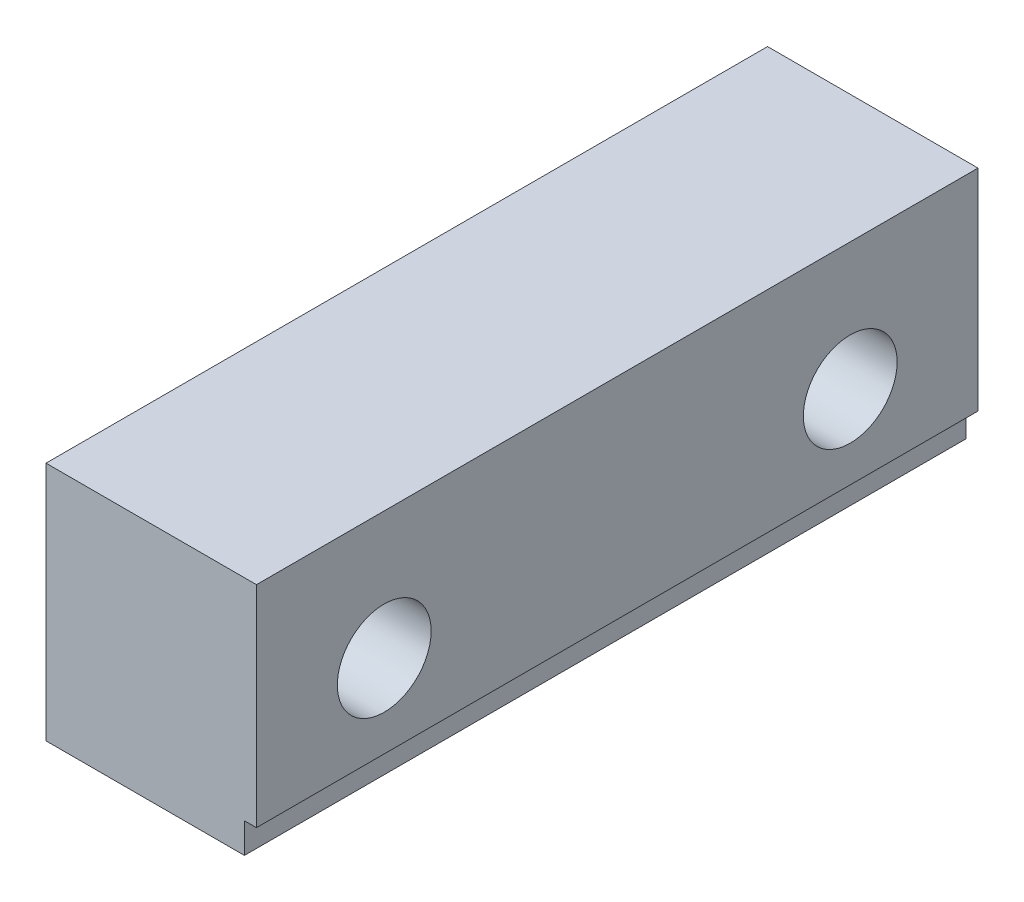
ISO-10303-21;
HEADER;
FILE_DESCRIPTION(('STEP AP214'),'2;1');
FILE_NAME('part.step','',(''),(''),'','','');
FILE_SCHEMA(('AUTOMOTIVE_DESIGN { 1 0 10303 214 1 1 1 1 }'));
ENDSEC;
DATA;
#1=APPLICATION_CONTEXT('core data for automotive mechanical design processes');
#2=APPLICATION_PROTOCOL_DEFINITION('international standard','automotive_design',2000,#1);
#3=PRODUCT_CONTEXT('',#1,'mechanical');
#4=PRODUCT('Part','Part','',(#3));
#5=PRODUCT_RELATED_PRODUCT_CATEGORY('part','',(#4));
#6=PRODUCT_DEFINITION_FORMATION('','',#4);
#7=PRODUCT_DEFINITION_CONTEXT('part definition',#1,'design');
#8=PRODUCT_DEFINITION('design','',#6,#7);
#9=PRODUCT_DEFINITION_SHAPE('','',#8);
#10=(LENGTH_UNIT() NAMED_UNIT(*) SI_UNIT(.MILLI.,.METRE.));
#11=(NAMED_UNIT(*) PLANE_ANGLE_UNIT() SI_UNIT($,.RADIAN.));
#12=(NAMED_UNIT(*) SI_UNIT($,.STERADIAN.) SOLID_ANGLE_UNIT());
#13=UNCERTAINTY_MEASURE_WITH_UNIT(LENGTH_MEASURE(1.E-05),#10,'distance_accuracy_value','');
#14=(GEOMETRIC_REPRESENTATION_CONTEXT(3) GLOBAL_UNCERTAINTY_ASSIGNED_CONTEXT((#13)) GLOBAL_UNIT_ASSIGNED_CONTEXT((#10,
#11,#12)) REPRESENTATION_CONTEXT('',''));
#15=CARTESIAN_POINT('',(0.,0.,0.));
#16=DIRECTION('',(0.,0.,1.));
#17=DIRECTION('',(1.,0.,0.));
#18=AXIS2_PLACEMENT_3D('',#15,#16,#17);
#19=CARTESIAN_POINT('',(-22.226,-1.52399999999999,-49.2125));
#20=DIRECTION('',(1.,0.,0.));
#21=DIRECTION('',(0.,0.,-1.));
#22=AXIS2_PLACEMENT_3D('',#19,#20,#21);
#23=CYLINDRICAL_SURFACE('',#22,6.731);
#24=CARTESIAN_POINT('',(-22.225,-1.52399999999999,-49.2125));
#25=DIRECTION('',(1.,0.,0.));
#26=DIRECTION('',(0.,0.,-1.));
#27=AXIS2_PLACEMENT_3D('',#24,#25,#26);
#28=CIRCLE('',#27,6.731);
#29=CARTESIAN_POINT('',(-22.225,-1.52399999999999,-55.9435));
#30=VERTEX_POINT('',#29);
#31=EDGE_CURVE('E177',#30,#30,#28,.F.);
#32=ORIENTED_EDGE('',*,*,#31,.T.);
#33=EDGE_LOOP('',(#32));
#34=FACE_BOUND('',#33,.T.);
#35=CARTESIAN_POINT('',(-16.383,-1.52399999999999,-49.2125));
#36=DIRECTION('',(1.,0.,0.));
#37=DIRECTION('',(0.,0.,-1.));
#38=AXIS2_PLACEMENT_3D('',#35,#36,#37);
#39=CIRCLE('',#38,6.731);
#40=CARTESIAN_POINT('',(-16.383,-1.52399999999999,-55.9435));
#41=VERTEX_POINT('',#40);
#42=EDGE_CURVE('E53',#41,#41,#39,.F.);
#43=ORIENTED_EDGE('',*,*,#42,.F.);
#44=EDGE_LOOP('',(#43));
#45=FACE_BOUND('',#44,.T.);
#46=ADVANCED_FACE('F49',(#34,#45),#23,.F.);
#47=CARTESIAN_POINT('',(-22.226,-1.52399999999999,49.2125));
#48=DIRECTION('',(1.,0.,0.));
#49=DIRECTION('',(0.,0.,-1.));
#50=AXIS2_PLACEMENT_3D('',#47,#48,#49);
#51=CYLINDRICAL_SURFACE('',#50,6.731);
#52=CARTESIAN_POINT('',(-22.225,-1.52399999999999,49.2125));
#53=DIRECTION('',(1.,0.,0.));
#54=DIRECTION('',(0.,0.,-1.));
#55=AXIS2_PLACEMENT_3D('',#52,#53,#54);
#56=CIRCLE('',#55,6.731);
#57=CARTESIAN_POINT('',(-22.225,-1.52399999999999,42.4815));
#58=VERTEX_POINT('',#57);
#59=EDGE_CURVE('E206',#58,#58,#56,.F.);
#60=ORIENTED_EDGE('',*,*,#59,.T.);
#61=EDGE_LOOP('',(#60));
#62=FACE_BOUND('',#61,.T.);
#63=CARTESIAN_POINT('',(-16.383,-1.52399999999999,49.2125));
#64=DIRECTION('',(1.,0.,0.));
#65=DIRECTION('',(0.,0.,-1.));
#66=AXIS2_PLACEMENT_3D('',#63,#64,#65);
#67=CIRCLE('',#66,6.731);
#68=CARTESIAN_POINT('',(-16.383,-1.52399999999999,42.4815));
#69=VERTEX_POINT('',#68);
#70=EDGE_CURVE('E168',#69,#69,#67,.F.);
#71=ORIENTED_EDGE('',*,*,#70,.F.);
#72=EDGE_LOOP('',(#71));
#73=FACE_BOUND('',#72,.T.);
#74=ADVANCED_FACE('F262',(#62,#73),#51,.F.);
#75=CARTESIAN_POINT('',(-22.225,-25.4,76.2));
#76=DIRECTION('',(1.,0.,0.));
#77=DIRECTION('',(0.,0.,-1.));
#78=AXIS2_PLACEMENT_3D('',#75,#76,#77);
#79=PLANE('',#78);
#80=ORIENTED_EDGE('',*,*,#59,.F.);
#81=EDGE_LOOP('',(#80));
#82=FACE_BOUND('',#81,.T.);
#83=ORIENTED_EDGE('',*,*,#31,.F.);
#84=EDGE_LOOP('',(#83));
#85=FACE_BOUND('',#84,.T.);
#86=DIRECTION('',(0.,-1.,0.));
#87=VECTOR('',#86,1.);
#88=CARTESIAN_POINT('',(-22.225,-25.4,-76.2));
#89=LINE('',#88,#87);
#90=CARTESIAN_POINT('',(-22.225,25.4,-76.2));
#91=VERTEX_POINT('',#90);
#92=CARTESIAN_POINT('',(-22.225,-25.4,-76.2));
#93=VERTEX_POINT('',#92);
#94=EDGE_CURVE('E147',#91,#93,#89,.T.);
#95=ORIENTED_EDGE('',*,*,#94,.T.);
#96=DIRECTION('',(0.,0.,-1.));
#97=VECTOR('',#96,1.);
#98=CARTESIAN_POINT('',(-22.225,-25.4,76.2));
#99=LINE('',#98,#97);
#100=CARTESIAN_POINT('',(-22.225,-25.4,76.2));
#101=VERTEX_POINT('',#100);
#102=EDGE_CURVE('E12',#101,#93,#99,.T.);
#103=ORIENTED_EDGE('',*,*,#102,.F.);
#104=DIRECTION('',(0.,-1.,0.));
#105=VECTOR('',#104,1.);
#106=CARTESIAN_POINT('',(-22.225,-25.4,76.2));
#107=LINE('',#106,#105);
#108=CARTESIAN_POINT('',(-22.225,25.4,76.2));
#109=VERTEX_POINT('',#108);
#110=EDGE_CURVE('E144',#109,#101,#107,.T.);
#111=ORIENTED_EDGE('',*,*,#110,.F.);
#112=DIRECTION('',(0.,0.,-1.));
#113=VECTOR('',#112,1.);
#114=CARTESIAN_POINT('',(-22.225,25.4,76.2));
#115=LINE('',#114,#113);
#116=EDGE_CURVE('E164',#109,#91,#115,.T.);
#117=ORIENTED_EDGE('',*,*,#116,.T.);
#118=EDGE_LOOP('',(#95,#103,#111,#117));
#119=FACE_BOUND('',#118,.T.);
#120=ADVANCED_FACE('F51',(#82,#85,#119),#79,.F.);
#121=CARTESIAN_POINT('',(22.225,-25.4,76.2));
#122=DIRECTION('',(0.,1.,0.));
#123=DIRECTION('',(-1.,0.,0.));
#124=AXIS2_PLACEMENT_3D('',#121,#122,#123);
#125=PLANE('',#124);
#126=DIRECTION('',(1.,0.,0.));
#127=VECTOR('',#126,1.);
#128=CARTESIAN_POINT('',(22.225,-25.4,-76.2));
#129=LINE('',#128,#127);
#130=CARTESIAN_POINT('',(19.685,-25.4,-76.2));
#131=VERTEX_POINT('',#130);
#132=EDGE_CURVE('E140',#93,#131,#129,.T.);
#133=ORIENTED_EDGE('',*,*,#132,.T.);
#134=DIRECTION('',(0.,0.,1.));
#135=VECTOR('',#134,1.);
#136=CARTESIAN_POINT('',(19.685,-25.4,-76.2));
#137=LINE('',#136,#135);
#138=CARTESIAN_POINT('',(19.685,-25.4,76.2));
#139=VERTEX_POINT('',#138);
#140=EDGE_CURVE('E205',#131,#139,#137,.T.);
#141=ORIENTED_EDGE('',*,*,#140,.T.);
#142=DIRECTION('',(1.,0.,0.));
#143=VECTOR('',#142,1.);
#144=CARTESIAN_POINT('',(22.225,-25.4,76.2));
#145=LINE('',#144,#143);
#146=EDGE_CURVE('E102',#101,#139,#145,.T.);
#147=ORIENTED_EDGE('',*,*,#146,.F.);
#148=ORIENTED_EDGE('',*,*,#102,.T.);
#149=EDGE_LOOP('',(#133,#141,#147,#148));
#150=FACE_BOUND('',#149,.T.);
#151=ADVANCED_FACE('F244',(#150),#125,.F.);
#152=CARTESIAN_POINT('',(22.225,-25.4,76.2));
#153=DIRECTION('',(-1.,0.,0.));
#154=DIRECTION('',(0.,0.,1.));
#155=AXIS2_PLACEMENT_3D('',#152,#153,#154);
#156=PLANE('',#155);
#157=CARTESIAN_POINT('',(22.225,-1.52399999999999,49.2125));
#158=DIRECTION('',(1.,0.,0.));
#159=DIRECTION('',(0.,0.,-1.));
#160=AXIS2_PLACEMENT_3D('',#157,#158,#159);
#161=CIRCLE('',#160,9.906);
#162=CARTESIAN_POINT('',(22.225,-1.52399999999999,39.3065));
#163=VERTEX_POINT('',#162);
#164=EDGE_CURVE('E198',#163,#163,#161,.T.);
#165=ORIENTED_EDGE('',*,*,#164,.F.);
#166=EDGE_LOOP('',(#165));
#167=FACE_BOUND('',#166,.T.);
#168=CARTESIAN_POINT('',(22.225,-1.52399999999999,-49.2125));
#169=DIRECTION('',(1.,0.,0.));
#170=DIRECTION('',(0.,0.,-1.));
#171=AXIS2_PLACEMENT_3D('',#168,#169,#170);
#172=CIRCLE('',#171,9.906);
#173=CARTESIAN_POINT('',(22.225,-1.52399999999999,-59.1185));
#174=VERTEX_POINT('',#173);
#175=EDGE_CURVE('E193',#174,#174,#172,.T.);
#176=ORIENTED_EDGE('',*,*,#175,.F.);
#177=EDGE_LOOP('',(#176));
#178=FACE_BOUND('',#177,.T.);
#179=DIRECTION('',(0.,1.,0.));
#180=VECTOR('',#179,1.);
#181=CARTESIAN_POINT('',(22.225,-25.4,76.2));
#182=LINE('',#181,#180);
#183=CARTESIAN_POINT('',(22.225,-19.05,76.2));
#184=VERTEX_POINT('',#183);
#185=CARTESIAN_POINT('',(22.225,25.4,76.2));
#186=VERTEX_POINT('',#185);
#187=EDGE_CURVE('E134',#184,#186,#182,.T.);
#188=ORIENTED_EDGE('',*,*,#187,.F.);
#189=DIRECTION('',(0.,0.,1.));
#190=VECTOR('',#189,1.);
#191=CARTESIAN_POINT('',(22.225,-19.05,-76.2));
#192=LINE('',#191,#190);
#193=CARTESIAN_POINT('',(22.225,-19.05,-76.2));
#194=VERTEX_POINT('',#193);
#195=EDGE_CURVE('E121',#194,#184,#192,.T.);
#196=ORIENTED_EDGE('',*,*,#195,.F.);
#197=DIRECTION('',(0.,1.,0.));
#198=VECTOR('',#197,1.);
#199=CARTESIAN_POINT('',(22.225,-25.4,-76.2));
#200=LINE('',#199,#198);
#201=CARTESIAN_POINT('',(22.225,25.4,-76.2));
#202=VERTEX_POINT('',#201);
#203=EDGE_CURVE('E133',#194,#202,#200,.T.);
#204=ORIENTED_EDGE('',*,*,#203,.T.);
#205=DIRECTION('',(0.,0.,-1.));
#206=VECTOR('',#205,1.);
#207=CARTESIAN_POINT('',(22.225,25.4,76.2));
#208=LINE('',#207,#206);
#209=EDGE_CURVE('E59',#186,#202,#208,.T.);
#210=ORIENTED_EDGE('',*,*,#209,.F.);
#211=EDGE_LOOP('',(#188,#196,#204,#210));
#212=FACE_BOUND('',#211,.T.);
#213=ADVANCED_FACE('F131',(#167,#178,#212),#156,.F.);
#214=CARTESIAN_POINT('',(22.225,25.4,76.2));
#215=DIRECTION('',(0.,-1.,0.));
#216=DIRECTION('',(1.,0.,0.));
#217=AXIS2_PLACEMENT_3D('',#214,#215,#216);
#218=PLANE('',#217);
#219=DIRECTION('',(-1.,0.,0.));
#220=VECTOR('',#219,1.);
#221=CARTESIAN_POINT('',(22.225,25.4,-76.2));
#222=LINE('',#221,#220);
#223=EDGE_CURVE('E96',#202,#91,#222,.T.);
#224=ORIENTED_EDGE('',*,*,#223,.T.);
#225=ORIENTED_EDGE('',*,*,#116,.F.);
#226=DIRECTION('',(-1.,0.,0.));
#227=VECTOR('',#226,1.);
#228=CARTESIAN_POINT('',(22.225,25.4,76.2));
#229=LINE('',#228,#227);
#230=EDGE_CURVE('E78',#186,#109,#229,.T.);
#231=ORIENTED_EDGE('',*,*,#230,.F.);
#232=ORIENTED_EDGE('',*,*,#209,.T.);
#233=EDGE_LOOP('',(#224,#225,#231,#232));
#234=FACE_BOUND('',#233,.T.);
#235=ADVANCED_FACE('F249',(#234),#218,.F.);
#236=CARTESIAN_POINT('',(0.,0.,76.2));
#237=DIRECTION('',(0.,0.,1.));
#238=DIRECTION('',(1.,0.,0.));
#239=AXIS2_PLACEMENT_3D('',#236,#237,#238);
#240=PLANE('',#239);
#241=DIRECTION('',(0.,-1.,0.));
#242=VECTOR('',#241,1.);
#243=CARTESIAN_POINT('',(19.685,-25.4,76.2));
#244=LINE('',#243,#242);
#245=CARTESIAN_POINT('',(19.685,-19.05,76.2));
#246=VERTEX_POINT('',#245);
#247=EDGE_CURVE('E127',#246,#139,#244,.T.);
#248=ORIENTED_EDGE('',*,*,#247,.F.);
#249=DIRECTION('',(-1.,0.,0.));
#250=VECTOR('',#249,1.);
#251=CARTESIAN_POINT('',(22.225,-19.05,76.2));
#252=LINE('',#251,#250);
#253=EDGE_CURVE('E240',#184,#246,#252,.T.);
#254=ORIENTED_EDGE('',*,*,#253,.F.);
#255=ORIENTED_EDGE('',*,*,#187,.T.);
#256=ORIENTED_EDGE('',*,*,#230,.T.);
#257=ORIENTED_EDGE('',*,*,#110,.T.);
#258=ORIENTED_EDGE('',*,*,#146,.T.);
#259=EDGE_LOOP('',(#248,#254,#255,#256,#257,#258));
#260=FACE_BOUND('',#259,.T.);
#261=ADVANCED_FACE('F251',(#260),#240,.T.);
#262=CARTESIAN_POINT('',(0.,0.,-76.2));
#263=DIRECTION('',(0.,0.,1.));
#264=DIRECTION('',(1.,0.,0.));
#265=AXIS2_PLACEMENT_3D('',#262,#263,#264);
#266=PLANE('',#265);
#267=DIRECTION('',(-1.,0.,0.));
#268=VECTOR('',#267,1.);
#269=CARTESIAN_POINT('',(22.225,-19.05,-76.2));
#270=LINE('',#269,#268);
#271=CARTESIAN_POINT('',(19.685,-19.05,-76.2));
#272=VERTEX_POINT('',#271);
#273=EDGE_CURVE('E117',#194,#272,#270,.T.);
#274=ORIENTED_EDGE('',*,*,#273,.T.);
#275=DIRECTION('',(0.,-1.,0.));
#276=VECTOR('',#275,1.);
#277=CARTESIAN_POINT('',(19.685,-25.4,-76.2));
#278=LINE('',#277,#276);
#279=EDGE_CURVE('E67',#272,#131,#278,.T.);
#280=ORIENTED_EDGE('',*,*,#279,.T.);
#281=ORIENTED_EDGE('',*,*,#132,.F.);
#282=ORIENTED_EDGE('',*,*,#94,.F.);
#283=ORIENTED_EDGE('',*,*,#223,.F.);
#284=ORIENTED_EDGE('',*,*,#203,.F.);
#285=EDGE_LOOP('',(#274,#280,#281,#282,#283,#284));
#286=FACE_BOUND('',#285,.T.);
#287=ADVANCED_FACE('F137',(#286),#266,.F.);
#288=CARTESIAN_POINT('',(-16.383,-1.52399999999999,49.2125));
#289=DIRECTION('',(1.,0.,0.));
#290=DIRECTION('',(0.,0.,-1.));
#291=AXIS2_PLACEMENT_3D('',#288,#289,#290);
#292=PLANE('',#291);
#293=CARTESIAN_POINT('',(-16.383,-1.52399999999999,49.2125));
#294=DIRECTION('',(1.,0.,0.));
#295=DIRECTION('',(0.,0.,-1.));
#296=AXIS2_PLACEMENT_3D('',#293,#294,#295);
#297=CIRCLE('',#296,9.906);
#298=CARTESIAN_POINT('',(-16.383,-1.52399999999999,39.3065));
#299=VERTEX_POINT('',#298);
#300=EDGE_CURVE('E223',#299,#299,#297,.T.);
#301=ORIENTED_EDGE('',*,*,#300,.T.);
#302=EDGE_LOOP('',(#301));
#303=FACE_BOUND('',#302,.T.);
#304=ORIENTED_EDGE('',*,*,#70,.T.);
#305=EDGE_LOOP('',(#304));
#306=FACE_BOUND('',#305,.T.);
#307=ADVANCED_FACE('F271',(#303,#306),#292,.T.);
#308=CARTESIAN_POINT('',(-16.383,-1.52399999999999,49.2125));
#309=DIRECTION('',(1.,0.,0.));
#310=DIRECTION('',(0.,0.,-1.));
#311=AXIS2_PLACEMENT_3D('',#308,#309,#310);
#312=CYLINDRICAL_SURFACE('',#311,9.906);
#313=ORIENTED_EDGE('',*,*,#300,.F.);
#314=EDGE_LOOP('',(#313));
#315=FACE_BOUND('',#314,.T.);
#316=ORIENTED_EDGE('',*,*,#164,.T.);
#317=EDGE_LOOP('',(#316));
#318=FACE_BOUND('',#317,.T.);
#319=ADVANCED_FACE('F275',(#315,#318),#312,.F.);
#320=CARTESIAN_POINT('',(-16.383,-1.52399999999999,-49.2125));
#321=DIRECTION('',(1.,0.,0.));
#322=DIRECTION('',(0.,0.,-1.));
#323=AXIS2_PLACEMENT_3D('',#320,#321,#322);
#324=PLANE('',#323);
#325=CARTESIAN_POINT('',(-16.383,-1.52399999999999,-49.2125));
#326=DIRECTION('',(1.,0.,0.));
#327=DIRECTION('',(0.,0.,-1.));
#328=AXIS2_PLACEMENT_3D('',#325,#326,#327);
#329=CIRCLE('',#328,9.906);
#330=CARTESIAN_POINT('',(-16.383,-1.52399999999999,-59.1185));
#331=VERTEX_POINT('',#330);
#332=EDGE_CURVE('E199',#331,#331,#329,.T.);
#333=ORIENTED_EDGE('',*,*,#332,.T.);
#334=EDGE_LOOP('',(#333));
#335=FACE_BOUND('',#334,.T.);
#336=ORIENTED_EDGE('',*,*,#42,.T.);
#337=EDGE_LOOP('',(#336));
#338=FACE_BOUND('',#337,.T.);
#339=ADVANCED_FACE('F280',(#335,#338),#324,.T.);
#340=CARTESIAN_POINT('',(-16.383,-1.52399999999999,-49.2125));
#341=DIRECTION('',(1.,0.,0.));
#342=DIRECTION('',(0.,0.,-1.));
#343=AXIS2_PLACEMENT_3D('',#340,#341,#342);
#344=CYLINDRICAL_SURFACE('',#343,9.906);
#345=ORIENTED_EDGE('',*,*,#332,.F.);
#346=EDGE_LOOP('',(#345));
#347=FACE_BOUND('',#346,.T.);
#348=ORIENTED_EDGE('',*,*,#175,.T.);
#349=EDGE_LOOP('',(#348));
#350=FACE_BOUND('',#349,.T.);
#351=ADVANCED_FACE('F286',(#347,#350),#344,.F.);
#352=CARTESIAN_POINT('',(19.685,-25.4,-76.2));
#353=DIRECTION('',(-1.,0.,0.));
#354=DIRECTION('',(0.,0.,1.));
#355=AXIS2_PLACEMENT_3D('',#352,#353,#354);
#356=PLANE('',#355);
#357=ORIENTED_EDGE('',*,*,#247,.T.);
#358=ORIENTED_EDGE('',*,*,#140,.F.);
#359=ORIENTED_EDGE('',*,*,#279,.F.);
#360=DIRECTION('',(0.,0.,1.));
#361=VECTOR('',#360,1.);
#362=CARTESIAN_POINT('',(19.685,-19.05,-76.2));
#363=LINE('',#362,#361);
#364=EDGE_CURVE('E123',#272,#246,#363,.T.);
#365=ORIENTED_EDGE('',*,*,#364,.T.);
#366=EDGE_LOOP('',(#357,#358,#359,#365));
#367=FACE_BOUND('',#366,.T.);
#368=ADVANCED_FACE('F288',(#367),#356,.F.);
#369=CARTESIAN_POINT('',(22.225,-19.05,-76.2));
#370=DIRECTION('',(0.,1.,0.));
#371=DIRECTION('',(0.,0.,1.));
#372=AXIS2_PLACEMENT_3D('',#369,#370,#371);
#373=PLANE('',#372);
#374=ORIENTED_EDGE('',*,*,#253,.T.);
#375=ORIENTED_EDGE('',*,*,#364,.F.);
#376=ORIENTED_EDGE('',*,*,#273,.F.);
#377=ORIENTED_EDGE('',*,*,#195,.T.);
#378=EDGE_LOOP('',(#374,#375,#376,#377));
#379=FACE_BOUND('',#378,.T.);
#380=ADVANCED_FACE('F120',(#379),#373,.F.);
#381=CLOSED_SHELL('',(#46,#74,#120,#151,#213,#235,#261,#287,#307,#319,#339,#351,#368,#380));
#382=MANIFOLD_SOLID_BREP('B2',#381);
#383=ADVANCED_BREP_SHAPE_REPRESENTATION('',(#18,#382),#14);
#384=SHAPE_DEFINITION_REPRESENTATION(#9,#383);
ENDSEC;
END-ISO-10303-21;
